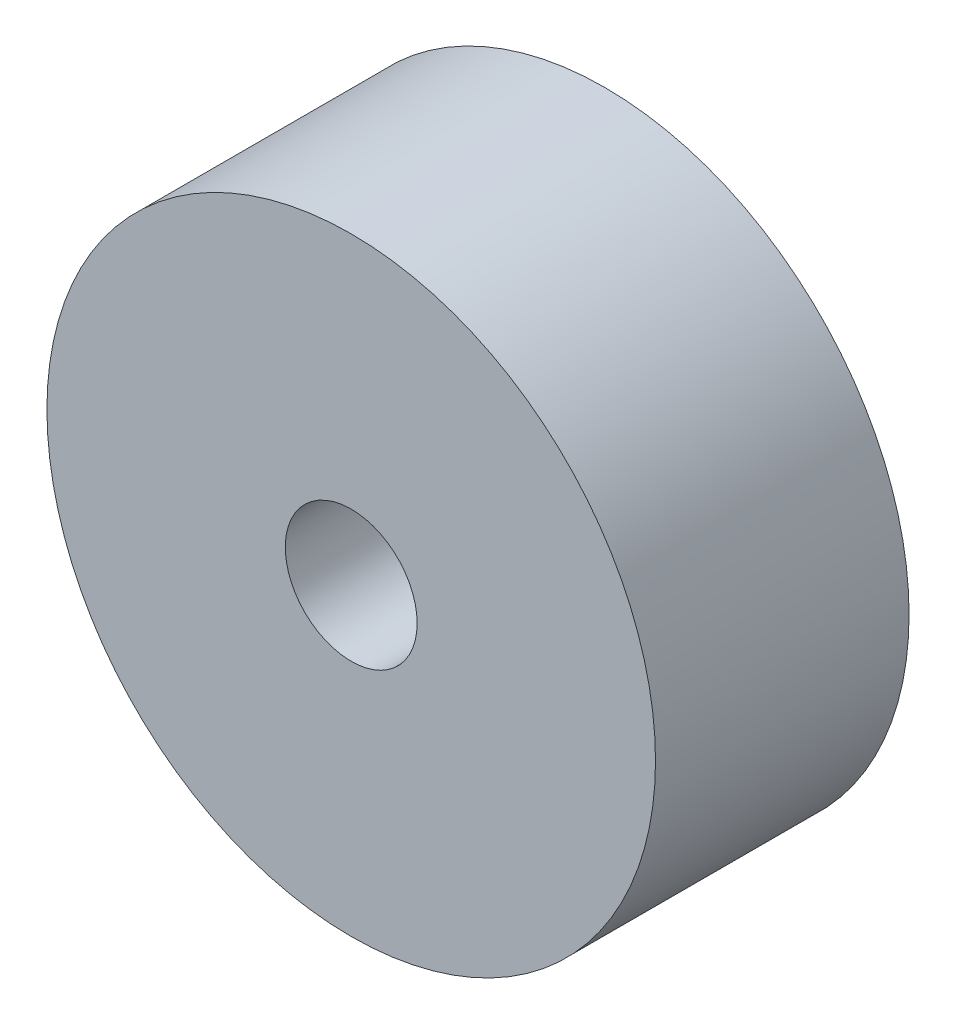
ISO-10303-21;
HEADER;
FILE_DESCRIPTION(('STEP AP214'),'2;1');
FILE_NAME('part.step','',(''),(''),'','','');
FILE_SCHEMA(('AUTOMOTIVE_DESIGN { 1 0 10303 214 1 1 1 1 }'));
ENDSEC;
DATA;
#1=APPLICATION_CONTEXT('core data for automotive mechanical design processes');
#2=APPLICATION_PROTOCOL_DEFINITION('international standard','automotive_design',2000,#1);
#3=PRODUCT_CONTEXT('',#1,'mechanical');
#4=PRODUCT('Part','Part','',(#3));
#5=PRODUCT_RELATED_PRODUCT_CATEGORY('part','',(#4));
#6=PRODUCT_DEFINITION_FORMATION('','',#4);
#7=PRODUCT_DEFINITION_CONTEXT('part definition',#1,'design');
#8=PRODUCT_DEFINITION('design','',#6,#7);
#9=PRODUCT_DEFINITION_SHAPE('','',#8);
#10=(LENGTH_UNIT() NAMED_UNIT(*) SI_UNIT(.MILLI.,.METRE.));
#11=(NAMED_UNIT(*) PLANE_ANGLE_UNIT() SI_UNIT($,.RADIAN.));
#12=(NAMED_UNIT(*) SI_UNIT($,.STERADIAN.) SOLID_ANGLE_UNIT());
#13=UNCERTAINTY_MEASURE_WITH_UNIT(LENGTH_MEASURE(1.E-05),#10,'distance_accuracy_value','');
#14=(GEOMETRIC_REPRESENTATION_CONTEXT(3) GLOBAL_UNCERTAINTY_ASSIGNED_CONTEXT((#13)) GLOBAL_UNIT_ASSIGNED_CONTEXT((#10,
#11,#12)) REPRESENTATION_CONTEXT('',''));
#15=CARTESIAN_POINT('',(0.,0.,0.));
#16=DIRECTION('',(0.,0.,1.));
#17=DIRECTION('',(1.,0.,0.));
#18=AXIS2_PLACEMENT_3D('',#15,#16,#17);
#19=CARTESIAN_POINT('',(0.,0.,5.));
#20=DIRECTION('',(0.,0.,1.));
#21=DIRECTION('',(1.,0.,0.));
#22=AXIS2_PLACEMENT_3D('',#19,#20,#21);
#23=PLANE('',#22);
#24=CARTESIAN_POINT('',(0.,0.,5.));
#25=DIRECTION('',(0.,0.,1.));
#26=DIRECTION('',(1.,0.,0.));
#27=AXIS2_PLACEMENT_3D('',#24,#25,#26);
#28=CIRCLE('',#27,6.);
#29=CARTESIAN_POINT('',(6.,0.,5.));
#30=VERTEX_POINT('',#29);
#31=EDGE_CURVE('E10',#30,#30,#28,.T.);
#32=ORIENTED_EDGE('',*,*,#31,.T.);
#33=EDGE_LOOP('',(#32));
#34=FACE_BOUND('',#33,.T.);
#35=CARTESIAN_POINT('',(0.,0.,5.));
#36=DIRECTION('',(0.,0.,1.));
#37=DIRECTION('',(1.,0.,0.));
#38=AXIS2_PLACEMENT_3D('',#35,#36,#37);
#39=CIRCLE('',#38,1.3);
#40=CARTESIAN_POINT('',(1.3,0.,5.));
#41=VERTEX_POINT('',#40);
#42=EDGE_CURVE('E41',#41,#41,#39,.T.);
#43=ORIENTED_EDGE('',*,*,#42,.F.);
#44=EDGE_LOOP('',(#43));
#45=FACE_BOUND('',#44,.T.);
#46=ADVANCED_FACE('F30',(#34,#45),#23,.T.);
#47=CARTESIAN_POINT('',(0.,0.,0.));
#48=DIRECTION('',(0.,0.,1.));
#49=DIRECTION('',(1.,0.,0.));
#50=AXIS2_PLACEMENT_3D('',#47,#48,#49);
#51=PLANE('',#50);
#52=CARTESIAN_POINT('',(0.,0.,0.));
#53=DIRECTION('',(0.,0.,1.));
#54=DIRECTION('',(1.,0.,0.));
#55=AXIS2_PLACEMENT_3D('',#52,#53,#54);
#56=CIRCLE('',#55,6.);
#57=CARTESIAN_POINT('',(6.,0.,0.));
#58=VERTEX_POINT('',#57);
#59=EDGE_CURVE('E34',#58,#58,#56,.T.);
#60=ORIENTED_EDGE('',*,*,#59,.F.);
#61=EDGE_LOOP('',(#60));
#62=FACE_BOUND('',#61,.T.);
#63=CARTESIAN_POINT('',(0.,0.,0.));
#64=DIRECTION('',(0.,0.,1.));
#65=DIRECTION('',(1.,0.,0.));
#66=AXIS2_PLACEMENT_3D('',#63,#64,#65);
#67=CIRCLE('',#66,1.3);
#68=CARTESIAN_POINT('',(1.3,0.,0.));
#69=VERTEX_POINT('',#68);
#70=EDGE_CURVE('E43',#69,#69,#67,.T.);
#71=ORIENTED_EDGE('',*,*,#70,.T.);
#72=EDGE_LOOP('',(#71));
#73=FACE_BOUND('',#72,.T.);
#74=ADVANCED_FACE('F53',(#62,#73),#51,.F.);
#75=CARTESIAN_POINT('',(0.,0.,5.));
#76=DIRECTION('',(0.,0.,-1.));
#77=DIRECTION('',(-1.,0.,0.));
#78=AXIS2_PLACEMENT_3D('',#75,#76,#77);
#79=CYLINDRICAL_SURFACE('',#78,6.);
#80=ORIENTED_EDGE('',*,*,#31,.F.);
#81=EDGE_LOOP('',(#80));
#82=FACE_BOUND('',#81,.T.);
#83=ORIENTED_EDGE('',*,*,#59,.T.);
#84=EDGE_LOOP('',(#83));
#85=FACE_BOUND('',#84,.T.);
#86=ADVANCED_FACE('F32',(#82,#85),#79,.T.);
#87=CARTESIAN_POINT('',(0.,0.,5.));
#88=DIRECTION('',(0.,0.,-1.));
#89=DIRECTION('',(-1.,0.,0.));
#90=AXIS2_PLACEMENT_3D('',#87,#88,#89);
#91=CYLINDRICAL_SURFACE('',#90,1.3);
#92=ORIENTED_EDGE('',*,*,#42,.T.);
#93=EDGE_LOOP('',(#92));
#94=FACE_BOUND('',#93,.T.);
#95=ORIENTED_EDGE('',*,*,#70,.F.);
#96=EDGE_LOOP('',(#95));
#97=FACE_BOUND('',#96,.T.);
#98=ADVANCED_FACE('F49',(#94,#97),#91,.F.);
#99=CLOSED_SHELL('',(#46,#74,#86,#98));
#100=MANIFOLD_SOLID_BREP('B2',#99);
#101=ADVANCED_BREP_SHAPE_REPRESENTATION('',(#18,#100),#14);
#102=SHAPE_DEFINITION_REPRESENTATION(#9,#101);
ENDSEC;
END-ISO-10303-21;
